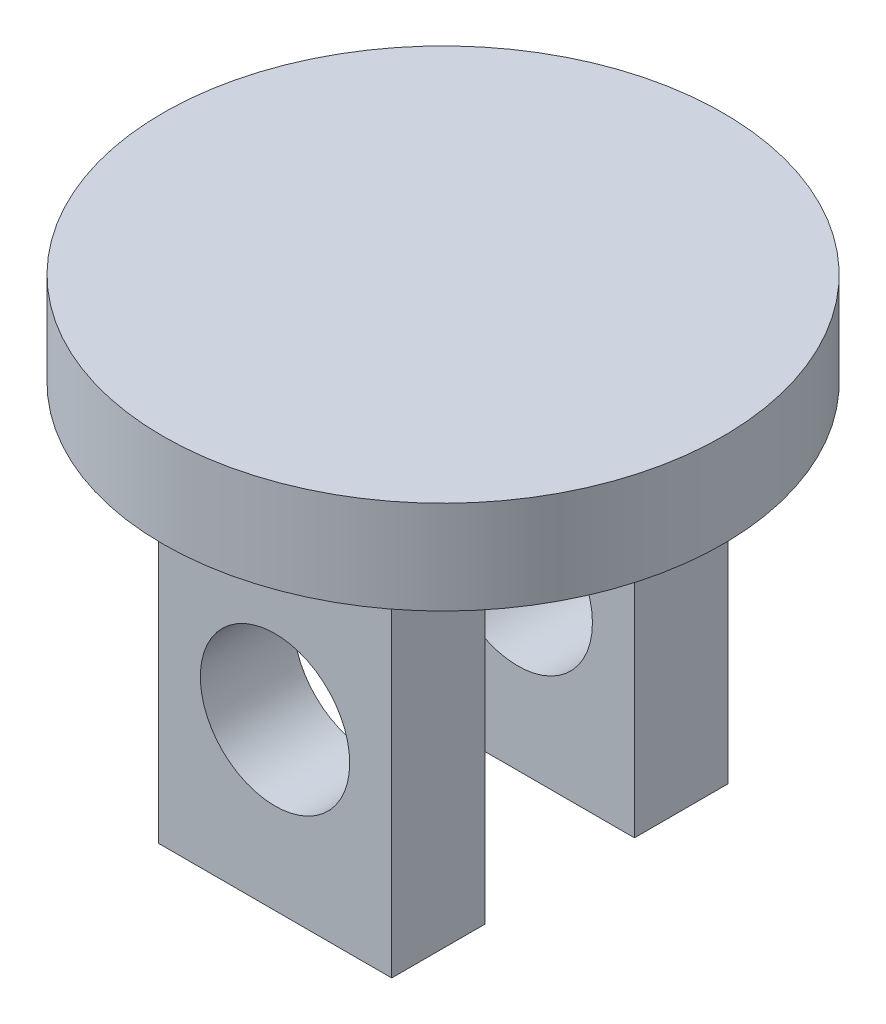
ISO-10303-21;
HEADER;
FILE_DESCRIPTION(('STEP AP214'),'2;1');
FILE_NAME('part.step','',(''),(''),'','','');
FILE_SCHEMA(('AUTOMOTIVE_DESIGN { 1 0 10303 214 1 1 1 1 }'));
ENDSEC;
DATA;
#1=APPLICATION_CONTEXT('core data for automotive mechanical design processes');
#2=APPLICATION_PROTOCOL_DEFINITION('international standard','automotive_design',2000,#1);
#3=PRODUCT_CONTEXT('',#1,'mechanical');
#4=PRODUCT('Part','Part','',(#3));
#5=PRODUCT_RELATED_PRODUCT_CATEGORY('part','',(#4));
#6=PRODUCT_DEFINITION_FORMATION('','',#4);
#7=PRODUCT_DEFINITION_CONTEXT('part definition',#1,'design');
#8=PRODUCT_DEFINITION('design','',#6,#7);
#9=PRODUCT_DEFINITION_SHAPE('','',#8);
#10=(LENGTH_UNIT() NAMED_UNIT(*) SI_UNIT(.MILLI.,.METRE.));
#11=(NAMED_UNIT(*) PLANE_ANGLE_UNIT() SI_UNIT($,.RADIAN.));
#12=(NAMED_UNIT(*) SI_UNIT($,.STERADIAN.) SOLID_ANGLE_UNIT());
#13=UNCERTAINTY_MEASURE_WITH_UNIT(LENGTH_MEASURE(1.E-05),#10,'distance_accuracy_value','');
#14=(GEOMETRIC_REPRESENTATION_CONTEXT(3) GLOBAL_UNCERTAINTY_ASSIGNED_CONTEXT((#13)) GLOBAL_UNIT_ASSIGNED_CONTEXT((#10,
#11,#12)) REPRESENTATION_CONTEXT('',''));
#15=CARTESIAN_POINT('',(0.,0.,0.));
#16=DIRECTION('',(0.,0.,1.));
#17=DIRECTION('',(1.,0.,0.));
#18=AXIS2_PLACEMENT_3D('',#15,#16,#17);
#19=CARTESIAN_POINT('',(0.,0.,0.));
#20=DIRECTION('',(0.,1.,0.));
#21=DIRECTION('',(0.,0.,1.));
#22=AXIS2_PLACEMENT_3D('',#19,#20,#21);
#23=PLANE('',#22);
#24=DIRECTION('',(0.,0.,1.));
#25=VECTOR('',#24,1.);
#26=CARTESIAN_POINT('',(2.5,0.,0.));
#27=LINE('',#26,#25);
#28=CARTESIAN_POINT('',(2.5,0.,-3.6));
#29=VERTEX_POINT('',#28);
#30=CARTESIAN_POINT('',(2.5,0.,-1.6));
#31=VERTEX_POINT('',#30);
#32=EDGE_CURVE('E141',#29,#31,#27,.T.);
#33=ORIENTED_EDGE('',*,*,#32,.F.);
#34=DIRECTION('',(1.,0.,0.));
#35=VECTOR('',#34,1.);
#36=CARTESIAN_POINT('',(0.,0.,-3.6));
#37=LINE('',#36,#35);
#38=CARTESIAN_POINT('',(-2.5,0.,-3.6));
#39=VERTEX_POINT('',#38);
#40=EDGE_CURVE('E159',#39,#29,#37,.T.);
#41=ORIENTED_EDGE('',*,*,#40,.F.);
#42=DIRECTION('',(0.,0.,1.));
#43=VECTOR('',#42,1.);
#44=CARTESIAN_POINT('',(-2.5,0.,0.));
#45=LINE('',#44,#43);
#46=CARTESIAN_POINT('',(-2.5,0.,-1.6));
#47=VERTEX_POINT('',#46);
#48=EDGE_CURVE('E162',#39,#47,#45,.T.);
#49=ORIENTED_EDGE('',*,*,#48,.T.);
#50=DIRECTION('',(1.,0.,0.));
#51=VECTOR('',#50,1.);
#52=CARTESIAN_POINT('',(0.,0.,-1.6));
#53=LINE('',#52,#51);
#54=EDGE_CURVE('E148',#47,#31,#53,.T.);
#55=ORIENTED_EDGE('',*,*,#54,.T.);
#56=EDGE_LOOP('',(#33,#41,#49,#55));
#57=FACE_BOUND('',#56,.T.);
#58=CARTESIAN_POINT('',(0.,0.,0.));
#59=DIRECTION('',(0.,1.,0.));
#60=DIRECTION('',(0.,0.,1.));
#61=AXIS2_PLACEMENT_3D('',#58,#59,#60);
#62=CIRCLE('',#61,6.);
#63=CARTESIAN_POINT('',(0.,0.,6.));
#64=VERTEX_POINT('',#63);
#65=EDGE_CURVE('E46',#64,#64,#62,.T.);
#66=ORIENTED_EDGE('',*,*,#65,.F.);
#67=EDGE_LOOP('',(#66));
#68=FACE_BOUND('',#67,.T.);
#69=DIRECTION('',(0.,0.,1.));
#70=VECTOR('',#69,1.);
#71=CARTESIAN_POINT('',(2.5,0.,0.));
#72=LINE('',#71,#70);
#73=CARTESIAN_POINT('',(2.5,0.,1.6));
#74=VERTEX_POINT('',#73);
#75=CARTESIAN_POINT('',(2.5,0.,3.6));
#76=VERTEX_POINT('',#75);
#77=EDGE_CURVE('E136',#74,#76,#72,.T.);
#78=ORIENTED_EDGE('',*,*,#77,.F.);
#79=DIRECTION('',(1.,0.,0.));
#80=VECTOR('',#79,1.);
#81=CARTESIAN_POINT('',(0.,0.,1.6));
#82=LINE('',#81,#80);
#83=CARTESIAN_POINT('',(-2.5,0.,1.6));
#84=VERTEX_POINT('',#83);
#85=EDGE_CURVE('E119',#84,#74,#82,.T.);
#86=ORIENTED_EDGE('',*,*,#85,.F.);
#87=DIRECTION('',(0.,0.,1.));
#88=VECTOR('',#87,1.);
#89=CARTESIAN_POINT('',(-2.5,0.,0.));
#90=LINE('',#89,#88);
#91=CARTESIAN_POINT('',(-2.5,0.,3.6));
#92=VERTEX_POINT('',#91);
#93=EDGE_CURVE('E59',#84,#92,#90,.T.);
#94=ORIENTED_EDGE('',*,*,#93,.T.);
#95=DIRECTION('',(1.,0.,0.));
#96=VECTOR('',#95,1.);
#97=CARTESIAN_POINT('',(0.,0.,3.6));
#98=LINE('',#97,#96);
#99=EDGE_CURVE('E54',#92,#76,#98,.T.);
#100=ORIENTED_EDGE('',*,*,#99,.T.);
#101=EDGE_LOOP('',(#78,#86,#94,#100));
#102=FACE_BOUND('',#101,.T.);
#103=ADVANCED_FACE('F37',(#57,#68,#102),#23,.F.);
#104=CARTESIAN_POINT('',(0.,2.,0.));
#105=DIRECTION('',(0.,-1.,0.));
#106=DIRECTION('',(0.,0.,-1.));
#107=AXIS2_PLACEMENT_3D('',#104,#105,#106);
#108=CYLINDRICAL_SURFACE('',#107,6.);
#109=CARTESIAN_POINT('',(0.,2.,0.));
#110=DIRECTION('',(0.,1.,0.));
#111=DIRECTION('',(0.,0.,1.));
#112=AXIS2_PLACEMENT_3D('',#109,#110,#111);
#113=CIRCLE('',#112,6.);
#114=CARTESIAN_POINT('',(0.,2.,6.));
#115=VERTEX_POINT('',#114);
#116=EDGE_CURVE('E11',#115,#115,#113,.T.);
#117=ORIENTED_EDGE('',*,*,#116,.F.);
#118=EDGE_LOOP('',(#117));
#119=FACE_BOUND('',#118,.T.);
#120=ORIENTED_EDGE('',*,*,#65,.T.);
#121=EDGE_LOOP('',(#120));
#122=FACE_BOUND('',#121,.T.);
#123=ADVANCED_FACE('F39',(#119,#122),#108,.T.);
#124=CARTESIAN_POINT('',(0.,2.,0.));
#125=DIRECTION('',(0.,1.,0.));
#126=DIRECTION('',(0.,0.,1.));
#127=AXIS2_PLACEMENT_3D('',#124,#125,#126);
#128=PLANE('',#127);
#129=ORIENTED_EDGE('',*,*,#116,.T.);
#130=EDGE_LOOP('',(#129));
#131=FACE_BOUND('',#130,.T.);
#132=ADVANCED_FACE('F220',(#131),#128,.T.);
#133=CARTESIAN_POINT('',(2.5,-8.,0.));
#134=DIRECTION('',(-1.,0.,0.));
#135=DIRECTION('',(0.,0.,1.));
#136=AXIS2_PLACEMENT_3D('',#133,#134,#135);
#137=PLANE('',#136);
#138=ORIENTED_EDGE('',*,*,#32,.T.);
#139=DIRECTION('',(0.,1.,0.));
#140=VECTOR('',#139,1.);
#141=CARTESIAN_POINT('',(2.5,-8.,-1.6));
#142=LINE('',#141,#140);
#143=CARTESIAN_POINT('',(2.5,-8.,-1.6));
#144=VERTEX_POINT('',#143);
#145=EDGE_CURVE('E165',#144,#31,#142,.T.);
#146=ORIENTED_EDGE('',*,*,#145,.F.);
#147=DIRECTION('',(0.,0.,1.));
#148=VECTOR('',#147,1.);
#149=CARTESIAN_POINT('',(2.5,-8.,0.));
#150=LINE('',#149,#148);
#151=CARTESIAN_POINT('',(2.5,-8.,-3.6));
#152=VERTEX_POINT('',#151);
#153=EDGE_CURVE('E145',#152,#144,#150,.T.);
#154=ORIENTED_EDGE('',*,*,#153,.F.);
#155=DIRECTION('',(0.,1.,0.));
#156=VECTOR('',#155,1.);
#157=CARTESIAN_POINT('',(2.5,-8.,-3.6));
#158=LINE('',#157,#156);
#159=EDGE_CURVE('E156',#152,#29,#158,.T.);
#160=ORIENTED_EDGE('',*,*,#159,.T.);
#161=EDGE_LOOP('',(#138,#146,#154,#160));
#162=FACE_BOUND('',#161,.T.);
#163=ADVANCED_FACE('F211',(#162),#137,.F.);
#164=CARTESIAN_POINT('',(0.,-8.,-1.6));
#165=DIRECTION('',(0.,0.,1.));
#166=DIRECTION('',(1.,0.,0.));
#167=AXIS2_PLACEMENT_3D('',#164,#165,#166);
#168=PLANE('',#167);
#169=CARTESIAN_POINT('',(0.,-4.46004136021393,-1.6));
#170=DIRECTION('',(0.,0.,1.));
#171=DIRECTION('',(1.,0.,0.));
#172=AXIS2_PLACEMENT_3D('',#169,#170,#171);
#173=CIRCLE('',#172,1.6);
#174=CARTESIAN_POINT('',(1.6,-4.46004136021393,-1.6));
#175=VERTEX_POINT('',#174);
#176=EDGE_CURVE('E131',#175,#175,#173,.T.);
#177=ORIENTED_EDGE('',*,*,#176,.F.);
#178=EDGE_LOOP('',(#177));
#179=FACE_BOUND('',#178,.T.);
#180=ORIENTED_EDGE('',*,*,#54,.F.);
#181=DIRECTION('',(0.,1.,0.));
#182=VECTOR('',#181,1.);
#183=CARTESIAN_POINT('',(-2.5,-8.,-1.6));
#184=LINE('',#183,#182);
#185=CARTESIAN_POINT('',(-2.5,-8.,-1.6));
#186=VERTEX_POINT('',#185);
#187=EDGE_CURVE('E168',#186,#47,#184,.T.);
#188=ORIENTED_EDGE('',*,*,#187,.F.);
#189=DIRECTION('',(1.,0.,0.));
#190=VECTOR('',#189,1.);
#191=CARTESIAN_POINT('',(0.,-8.,-1.6));
#192=LINE('',#191,#190);
#193=EDGE_CURVE('E153',#186,#144,#192,.T.);
#194=ORIENTED_EDGE('',*,*,#193,.T.);
#195=ORIENTED_EDGE('',*,*,#145,.T.);
#196=EDGE_LOOP('',(#180,#188,#194,#195));
#197=FACE_BOUND('',#196,.T.);
#198=ADVANCED_FACE('F207',(#179,#197),#168,.T.);
#199=CARTESIAN_POINT('',(-2.5,-8.,0.));
#200=DIRECTION('',(-1.,0.,0.));
#201=DIRECTION('',(0.,0.,1.));
#202=AXIS2_PLACEMENT_3D('',#199,#200,#201);
#203=PLANE('',#202);
#204=ORIENTED_EDGE('',*,*,#48,.F.);
#205=DIRECTION('',(0.,1.,0.));
#206=VECTOR('',#205,1.);
#207=CARTESIAN_POINT('',(-2.5,-8.,-3.6));
#208=LINE('',#207,#206);
#209=CARTESIAN_POINT('',(-2.5,-8.,-3.6));
#210=VERTEX_POINT('',#209);
#211=EDGE_CURVE('E171',#210,#39,#208,.T.);
#212=ORIENTED_EDGE('',*,*,#211,.F.);
#213=DIRECTION('',(0.,0.,1.));
#214=VECTOR('',#213,1.);
#215=CARTESIAN_POINT('',(-2.5,-8.,0.));
#216=LINE('',#215,#214);
#217=EDGE_CURVE('E150',#210,#186,#216,.T.);
#218=ORIENTED_EDGE('',*,*,#217,.T.);
#219=ORIENTED_EDGE('',*,*,#187,.T.);
#220=EDGE_LOOP('',(#204,#212,#218,#219));
#221=FACE_BOUND('',#220,.T.);
#222=ADVANCED_FACE('F210',(#221),#203,.T.);
#223=CARTESIAN_POINT('',(0.,-8.,-3.6));
#224=DIRECTION('',(0.,0.,1.));
#225=DIRECTION('',(1.,0.,0.));
#226=AXIS2_PLACEMENT_3D('',#223,#224,#225);
#227=PLANE('',#226);
#228=CARTESIAN_POINT('',(0.,-4.46004136021393,-3.6));
#229=DIRECTION('',(0.,0.,1.));
#230=DIRECTION('',(1.,0.,0.));
#231=AXIS2_PLACEMENT_3D('',#228,#229,#230);
#232=CIRCLE('',#231,1.6);
#233=CARTESIAN_POINT('',(1.6,-4.46004136021393,-3.6));
#234=VERTEX_POINT('',#233);
#235=EDGE_CURVE('E317',#234,#234,#232,.T.);
#236=ORIENTED_EDGE('',*,*,#235,.T.);
#237=EDGE_LOOP('',(#236));
#238=FACE_BOUND('',#237,.T.);
#239=ORIENTED_EDGE('',*,*,#40,.T.);
#240=ORIENTED_EDGE('',*,*,#159,.F.);
#241=DIRECTION('',(1.,0.,0.));
#242=VECTOR('',#241,1.);
#243=CARTESIAN_POINT('',(0.,-8.,-3.6));
#244=LINE('',#243,#242);
#245=EDGE_CURVE('E147',#210,#152,#244,.T.);
#246=ORIENTED_EDGE('',*,*,#245,.F.);
#247=ORIENTED_EDGE('',*,*,#211,.T.);
#248=EDGE_LOOP('',(#239,#240,#246,#247));
#249=FACE_BOUND('',#248,.T.);
#250=ADVANCED_FACE('F205',(#238,#249),#227,.F.);
#251=CARTESIAN_POINT('',(0.,-8.,0.));
#252=DIRECTION('',(0.,1.,0.));
#253=DIRECTION('',(0.,0.,1.));
#254=AXIS2_PLACEMENT_3D('',#251,#252,#253);
#255=PLANE('',#254);
#256=ORIENTED_EDGE('',*,*,#153,.T.);
#257=ORIENTED_EDGE('',*,*,#193,.F.);
#258=ORIENTED_EDGE('',*,*,#217,.F.);
#259=ORIENTED_EDGE('',*,*,#245,.T.);
#260=EDGE_LOOP('',(#256,#257,#258,#259));
#261=FACE_BOUND('',#260,.T.);
#262=ADVANCED_FACE('F195',(#261),#255,.F.);
#263=CARTESIAN_POINT('',(2.5,-8.,0.));
#264=DIRECTION('',(-1.,0.,0.));
#265=DIRECTION('',(0.,0.,1.));
#266=AXIS2_PLACEMENT_3D('',#263,#264,#265);
#267=PLANE('',#266);
#268=ORIENTED_EDGE('',*,*,#77,.T.);
#269=DIRECTION('',(0.,1.,0.));
#270=VECTOR('',#269,1.);
#271=CARTESIAN_POINT('',(2.5,-8.,3.6));
#272=LINE('',#271,#270);
#273=CARTESIAN_POINT('',(2.5,-8.,3.6));
#274=VERTEX_POINT('',#273);
#275=EDGE_CURVE('E126',#274,#76,#272,.T.);
#276=ORIENTED_EDGE('',*,*,#275,.F.);
#277=DIRECTION('',(0.,0.,1.));
#278=VECTOR('',#277,1.);
#279=CARTESIAN_POINT('',(2.5,-8.,0.));
#280=LINE('',#279,#278);
#281=CARTESIAN_POINT('',(2.5,-8.,1.6));
#282=VERTEX_POINT('',#281);
#283=EDGE_CURVE('E108',#282,#274,#280,.T.);
#284=ORIENTED_EDGE('',*,*,#283,.F.);
#285=DIRECTION('',(0.,1.,0.));
#286=VECTOR('',#285,1.);
#287=CARTESIAN_POINT('',(2.5,-8.,1.6));
#288=LINE('',#287,#286);
#289=EDGE_CURVE('E117',#282,#74,#288,.T.);
#290=ORIENTED_EDGE('',*,*,#289,.T.);
#291=EDGE_LOOP('',(#268,#276,#284,#290));
#292=FACE_BOUND('',#291,.T.);
#293=ADVANCED_FACE('F125',(#292),#267,.F.);
#294=CARTESIAN_POINT('',(0.,-8.,3.6));
#295=DIRECTION('',(0.,0.,1.));
#296=DIRECTION('',(1.,0.,0.));
#297=AXIS2_PLACEMENT_3D('',#294,#295,#296);
#298=PLANE('',#297);
#299=CARTESIAN_POINT('',(0.,-4.46004136021393,3.6));
#300=DIRECTION('',(0.,0.,1.));
#301=DIRECTION('',(1.,0.,0.));
#302=AXIS2_PLACEMENT_3D('',#299,#300,#301);
#303=CIRCLE('',#302,1.6);
#304=CARTESIAN_POINT('',(1.6,-4.46004136021393,3.6));
#305=VERTEX_POINT('',#304);
#306=EDGE_CURVE('E319',#305,#305,#303,.T.);
#307=ORIENTED_EDGE('',*,*,#306,.F.);
#308=EDGE_LOOP('',(#307));
#309=FACE_BOUND('',#308,.T.);
#310=ORIENTED_EDGE('',*,*,#99,.F.);
#311=DIRECTION('',(0.,1.,0.));
#312=VECTOR('',#311,1.);
#313=CARTESIAN_POINT('',(-2.5,-8.,3.6));
#314=LINE('',#313,#312);
#315=CARTESIAN_POINT('',(-2.5,-8.,3.6));
#316=VERTEX_POINT('',#315);
#317=EDGE_CURVE('E142',#316,#92,#314,.T.);
#318=ORIENTED_EDGE('',*,*,#317,.F.);
#319=DIRECTION('',(1.,0.,0.));
#320=VECTOR('',#319,1.);
#321=CARTESIAN_POINT('',(0.,-8.,3.6));
#322=LINE('',#321,#320);
#323=EDGE_CURVE('E123',#316,#274,#322,.T.);
#324=ORIENTED_EDGE('',*,*,#323,.T.);
#325=ORIENTED_EDGE('',*,*,#275,.T.);
#326=EDGE_LOOP('',(#310,#318,#324,#325));
#327=FACE_BOUND('',#326,.T.);
#328=ADVANCED_FACE('F184',(#309,#327),#298,.T.);
#329=CARTESIAN_POINT('',(-2.5,-8.,0.));
#330=DIRECTION('',(-1.,0.,0.));
#331=DIRECTION('',(0.,0.,1.));
#332=AXIS2_PLACEMENT_3D('',#329,#330,#331);
#333=PLANE('',#332);
#334=ORIENTED_EDGE('',*,*,#93,.F.);
#335=DIRECTION('',(0.,1.,0.));
#336=VECTOR('',#335,1.);
#337=CARTESIAN_POINT('',(-2.5,-8.,1.6));
#338=LINE('',#337,#336);
#339=CARTESIAN_POINT('',(-2.5,-8.,1.6));
#340=VERTEX_POINT('',#339);
#341=EDGE_CURVE('E122',#340,#84,#338,.T.);
#342=ORIENTED_EDGE('',*,*,#341,.F.);
#343=DIRECTION('',(0.,0.,1.));
#344=VECTOR('',#343,1.);
#345=CARTESIAN_POINT('',(-2.5,-8.,0.));
#346=LINE('',#345,#344);
#347=EDGE_CURVE('E111',#340,#316,#346,.T.);
#348=ORIENTED_EDGE('',*,*,#347,.T.);
#349=ORIENTED_EDGE('',*,*,#317,.T.);
#350=EDGE_LOOP('',(#334,#342,#348,#349));
#351=FACE_BOUND('',#350,.T.);
#352=ADVANCED_FACE('F182',(#351),#333,.T.);
#353=CARTESIAN_POINT('',(0.,-8.,1.6));
#354=DIRECTION('',(0.,0.,1.));
#355=DIRECTION('',(1.,0.,0.));
#356=AXIS2_PLACEMENT_3D('',#353,#354,#355);
#357=PLANE('',#356);
#358=CARTESIAN_POINT('',(0.,-4.46004136021393,1.6));
#359=DIRECTION('',(0.,0.,1.));
#360=DIRECTION('',(1.,0.,0.));
#361=AXIS2_PLACEMENT_3D('',#358,#359,#360);
#362=CIRCLE('',#361,1.6);
#363=CARTESIAN_POINT('',(1.6,-4.46004136021393,1.6));
#364=VERTEX_POINT('',#363);
#365=EDGE_CURVE('E41',#364,#364,#362,.T.);
#366=ORIENTED_EDGE('',*,*,#365,.T.);
#367=EDGE_LOOP('',(#366));
#368=FACE_BOUND('',#367,.T.);
#369=ORIENTED_EDGE('',*,*,#85,.T.);
#370=ORIENTED_EDGE('',*,*,#289,.F.);
#371=DIRECTION('',(1.,0.,0.));
#372=VECTOR('',#371,1.);
#373=CARTESIAN_POINT('',(0.,-8.,1.6));
#374=LINE('',#373,#372);
#375=EDGE_CURVE('E103',#340,#282,#374,.T.);
#376=ORIENTED_EDGE('',*,*,#375,.F.);
#377=ORIENTED_EDGE('',*,*,#341,.T.);
#378=EDGE_LOOP('',(#369,#370,#376,#377));
#379=FACE_BOUND('',#378,.T.);
#380=ADVANCED_FACE('F118',(#368,#379),#357,.F.);
#381=CARTESIAN_POINT('',(0.,-8.,0.));
#382=DIRECTION('',(0.,1.,0.));
#383=DIRECTION('',(0.,0.,1.));
#384=AXIS2_PLACEMENT_3D('',#381,#382,#383);
#385=PLANE('',#384);
#386=ORIENTED_EDGE('',*,*,#283,.T.);
#387=ORIENTED_EDGE('',*,*,#323,.F.);
#388=ORIENTED_EDGE('',*,*,#347,.F.);
#389=ORIENTED_EDGE('',*,*,#375,.T.);
#390=EDGE_LOOP('',(#386,#387,#388,#389));
#391=FACE_BOUND('',#390,.T.);
#392=ADVANCED_FACE('F105',(#391),#385,.F.);
#393=CARTESIAN_POINT('',(0.,-4.46004136021393,-6.));
#394=DIRECTION('',(0.,0.,1.));
#395=DIRECTION('',(1.,0.,0.));
#396=AXIS2_PLACEMENT_3D('',#393,#394,#395);
#397=CYLINDRICAL_SURFACE('',#396,1.6);
#398=ORIENTED_EDGE('',*,*,#306,.T.);
#399=EDGE_LOOP('',(#398));
#400=FACE_BOUND('',#399,.T.);
#401=ORIENTED_EDGE('',*,*,#365,.F.);
#402=EDGE_LOOP('',(#401));
#403=FACE_BOUND('',#402,.T.);
#404=ADVANCED_FACE('F282',(#400,#403),#397,.F.);
#405=ORIENTED_EDGE('',*,*,#176,.T.);
#406=EDGE_LOOP('',(#405));
#407=FACE_BOUND('',#406,.T.);
#408=ORIENTED_EDGE('',*,*,#235,.F.);
#409=EDGE_LOOP('',(#408));
#410=FACE_BOUND('',#409,.T.);
#411=ADVANCED_FACE('F300',(#407,#410),#397,.F.);
#412=CLOSED_SHELL('',(#103,#123,#132,#163,#198,#222,#250,#262,#293,#328,#352,#380,#392,#404,#411));
#413=MANIFOLD_SOLID_BREP('B2',#412);
#414=ADVANCED_BREP_SHAPE_REPRESENTATION('',(#18,#413),#14);
#415=SHAPE_DEFINITION_REPRESENTATION(#9,#414);
ENDSEC;
END-ISO-10303-21;
